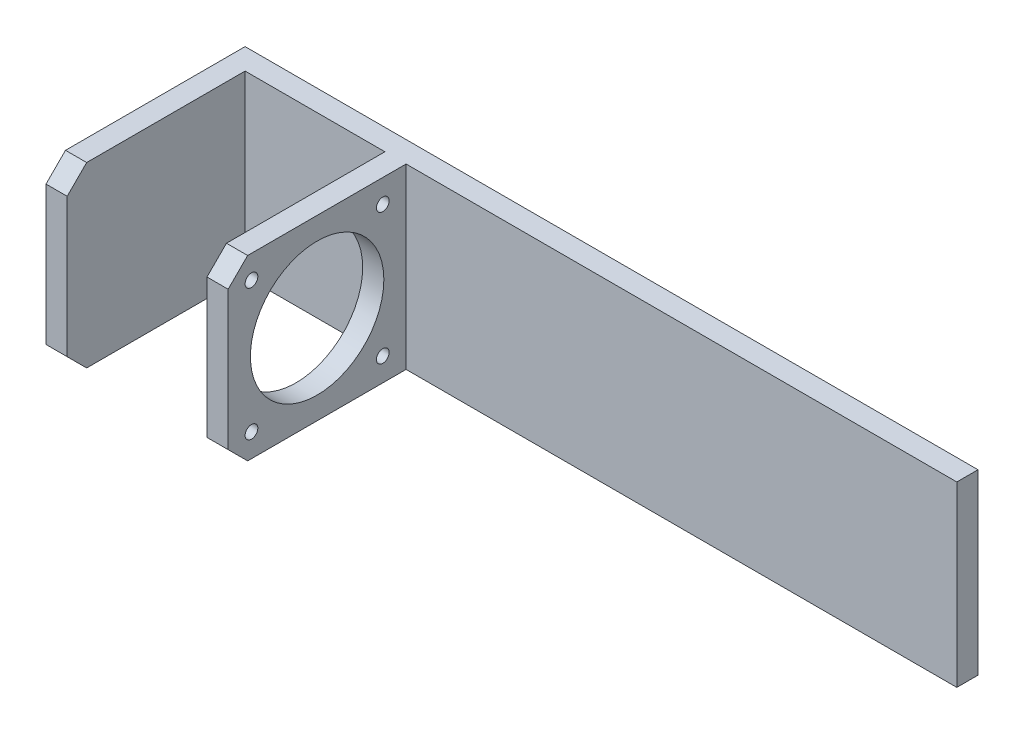
ISO-10303-21;
HEADER;
FILE_DESCRIPTION(('STEP AP214'),'2;1');
FILE_NAME('part.step','',(''),(''),'','','');
FILE_SCHEMA(('AUTOMOTIVE_DESIGN { 1 0 10303 214 1 1 1 1 }'));
ENDSEC;
DATA;
#1=APPLICATION_CONTEXT('core data for automotive mechanical design processes');
#2=APPLICATION_PROTOCOL_DEFINITION('international standard','automotive_design',2000,#1);
#3=PRODUCT_CONTEXT('',#1,'mechanical');
#4=PRODUCT('Part','Part','',(#3));
#5=PRODUCT_RELATED_PRODUCT_CATEGORY('part','',(#4));
#6=PRODUCT_DEFINITION_FORMATION('','',#4);
#7=PRODUCT_DEFINITION_CONTEXT('part definition',#1,'design');
#8=PRODUCT_DEFINITION('design','',#6,#7);
#9=PRODUCT_DEFINITION_SHAPE('','',#8);
#10=(LENGTH_UNIT() NAMED_UNIT(*) SI_UNIT(.MILLI.,.METRE.));
#11=(NAMED_UNIT(*) PLANE_ANGLE_UNIT() SI_UNIT($,.RADIAN.));
#12=(NAMED_UNIT(*) SI_UNIT($,.STERADIAN.) SOLID_ANGLE_UNIT());
#13=UNCERTAINTY_MEASURE_WITH_UNIT(LENGTH_MEASURE(1.E-05),#10,'distance_accuracy_value','');
#14=(GEOMETRIC_REPRESENTATION_CONTEXT(3) GLOBAL_UNCERTAINTY_ASSIGNED_CONTEXT((#13)) GLOBAL_UNIT_ASSIGNED_CONTEXT((#10,
#11,#12)) REPRESENTATION_CONTEXT('',''));
#15=CARTESIAN_POINT('',(0.,0.,0.));
#16=DIRECTION('',(0.,0.,1.));
#17=DIRECTION('',(1.,0.,0.));
#18=AXIS2_PLACEMENT_3D('',#15,#16,#17);
#19=CARTESIAN_POINT('',(0.,0.,0.));
#20=DIRECTION('',(1.,0.,0.));
#21=DIRECTION('',(0.,0.,-1.));
#22=AXIS2_PLACEMENT_3D('',#19,#20,#21);
#23=PLANE('',#22);
#24=CARTESIAN_POINT('',(0.,-15.5,15.5));
#25=DIRECTION('',(1.,0.,0.));
#26=DIRECTION('',(0.,0.,-1.));
#27=AXIS2_PLACEMENT_3D('',#24,#25,#26);
#28=CIRCLE('',#27,1.5);
#29=CARTESIAN_POINT('',(0.,-15.5,14.));
#30=VERTEX_POINT('',#29);
#31=EDGE_CURVE('E256',#30,#30,#28,.T.);
#32=ORIENTED_EDGE('',*,*,#31,.T.);
#33=EDGE_LOOP('',(#32));
#34=FACE_BOUND('',#33,.T.);
#35=CARTESIAN_POINT('',(0.,15.5,-15.5));
#36=DIRECTION('',(1.,0.,0.));
#37=DIRECTION('',(0.,0.,-1.));
#38=AXIS2_PLACEMENT_3D('',#35,#36,#37);
#39=CIRCLE('',#38,1.5);
#40=CARTESIAN_POINT('',(0.,15.5,-17.));
#41=VERTEX_POINT('',#40);
#42=EDGE_CURVE('E262',#41,#41,#39,.T.);
#43=ORIENTED_EDGE('',*,*,#42,.T.);
#44=EDGE_LOOP('',(#43));
#45=FACE_BOUND('',#44,.T.);
#46=CARTESIAN_POINT('',(0.,-15.5,-15.5));
#47=DIRECTION('',(1.,0.,0.));
#48=DIRECTION('',(0.,0.,-1.));
#49=AXIS2_PLACEMENT_3D('',#46,#47,#48);
#50=CIRCLE('',#49,1.5);
#51=CARTESIAN_POINT('',(0.,-15.5,-17.));
#52=VERTEX_POINT('',#51);
#53=EDGE_CURVE('E270',#52,#52,#50,.T.);
#54=ORIENTED_EDGE('',*,*,#53,.T.);
#55=EDGE_LOOP('',(#54));
#56=FACE_BOUND('',#55,.T.);
#57=CARTESIAN_POINT('',(0.,0.,0.));
#58=DIRECTION('',(1.,0.,0.));
#59=DIRECTION('',(0.,0.,-1.));
#60=AXIS2_PLACEMENT_3D('',#57,#58,#59);
#61=CIRCLE('',#60,15.75);
#62=CARTESIAN_POINT('',(0.,0.,-15.75));
#63=VERTEX_POINT('',#62);
#64=EDGE_CURVE('E278',#63,#63,#61,.T.);
#65=ORIENTED_EDGE('',*,*,#64,.T.);
#66=EDGE_LOOP('',(#65));
#67=FACE_BOUND('',#66,.T.);
#68=CARTESIAN_POINT('',(0.,15.5,15.5));
#69=DIRECTION('',(1.,0.,0.));
#70=DIRECTION('',(0.,0.,-1.));
#71=AXIS2_PLACEMENT_3D('',#68,#69,#70);
#72=CIRCLE('',#71,1.5);
#73=CARTESIAN_POINT('',(0.,15.5,14.));
#74=VERTEX_POINT('',#73);
#75=EDGE_CURVE('E286',#74,#74,#72,.T.);
#76=ORIENTED_EDGE('',*,*,#75,.T.);
#77=EDGE_LOOP('',(#76));
#78=FACE_BOUND('',#77,.T.);
#79=DIRECTION('',(0.,1.,0.));
#80=VECTOR('',#79,1.);
#81=CARTESIAN_POINT('',(0.,21.,-21.0000000004));
#82=LINE('',#81,#80);
#83=CARTESIAN_POINT('',(0.,-21.,-21.0000000004));
#84=VERTEX_POINT('',#83);
#85=CARTESIAN_POINT('',(0.,21.,-21.0000000004));
#86=VERTEX_POINT('',#85);
#87=EDGE_CURVE('E71',#84,#86,#82,.T.);
#88=ORIENTED_EDGE('',*,*,#87,.F.);
#89=DIRECTION('',(0.,0.,-1.));
#90=VECTOR('',#89,1.);
#91=CARTESIAN_POINT('',(0.,-21.,16.4000000004));
#92=LINE('',#91,#90);
#93=CARTESIAN_POINT('',(0.,-21.,16.4000000004));
#94=VERTEX_POINT('',#93);
#95=EDGE_CURVE('E325',#94,#84,#92,.T.);
#96=ORIENTED_EDGE('',*,*,#95,.F.);
#97=DIRECTION('',(0.,-0.707106781186547,-0.707106781186547));
#98=VECTOR('',#97,1.);
#99=CARTESIAN_POINT('',(0.,-16.4000000004,21.));
#100=LINE('',#99,#98);
#101=CARTESIAN_POINT('',(0.,-16.4000000004,21.));
#102=VERTEX_POINT('',#101);
#103=EDGE_CURVE('E322',#102,#94,#100,.T.);
#104=ORIENTED_EDGE('',*,*,#103,.F.);
#105=DIRECTION('',(0.,-1.,0.));
#106=VECTOR('',#105,1.);
#107=CARTESIAN_POINT('',(0.,16.4000000004,21.));
#108=LINE('',#107,#106);
#109=CARTESIAN_POINT('',(0.,16.4000000004,21.));
#110=VERTEX_POINT('',#109);
#111=EDGE_CURVE('E319',#110,#102,#108,.T.);
#112=ORIENTED_EDGE('',*,*,#111,.F.);
#113=DIRECTION('',(0.,-0.707106781186547,0.707106781186547));
#114=VECTOR('',#113,1.);
#115=CARTESIAN_POINT('',(0.,21.,16.4000000004));
#116=LINE('',#115,#114);
#117=CARTESIAN_POINT('',(0.,21.,16.4000000004));
#118=VERTEX_POINT('',#117);
#119=EDGE_CURVE('E294',#118,#110,#116,.T.);
#120=ORIENTED_EDGE('',*,*,#119,.F.);
#121=DIRECTION('',(0.,0.,1.));
#122=VECTOR('',#121,1.);
#123=CARTESIAN_POINT('',(0.,21.,-16.4000000004));
#124=LINE('',#123,#122);
#125=EDGE_CURVE('E303',#86,#118,#124,.T.);
#126=ORIENTED_EDGE('',*,*,#125,.F.);
#127=EDGE_LOOP('',(#88,#96,#104,#112,#120,#126));
#128=FACE_BOUND('',#127,.T.);
#129=ADVANCED_FACE('F47',(#34,#45,#56,#67,#78,#128),#23,.F.);
#130=CARTESIAN_POINT('',(5.,0.,0.));
#131=DIRECTION('',(1.,0.,0.));
#132=DIRECTION('',(0.,0.,-1.));
#133=AXIS2_PLACEMENT_3D('',#130,#131,#132);
#134=PLANE('',#133);
#135=DIRECTION('',(0.,-1.,0.));
#136=VECTOR('',#135,1.);
#137=CARTESIAN_POINT('',(5.,21.,-21.0000000004));
#138=LINE('',#137,#136);
#139=CARTESIAN_POINT('',(5.,21.,-21.0000000004));
#140=VERTEX_POINT('',#139);
#141=CARTESIAN_POINT('',(5.,-21.,-21.0000000004));
#142=VERTEX_POINT('',#141);
#143=EDGE_CURVE('E63',#140,#142,#138,.T.);
#144=ORIENTED_EDGE('',*,*,#143,.F.);
#145=DIRECTION('',(0.,0.,1.));
#146=VECTOR('',#145,1.);
#147=CARTESIAN_POINT('',(5.,21.,-16.4000000004));
#148=LINE('',#147,#146);
#149=CARTESIAN_POINT('',(5.,21.,16.4000000004));
#150=VERTEX_POINT('',#149);
#151=EDGE_CURVE('E312',#140,#150,#148,.T.);
#152=ORIENTED_EDGE('',*,*,#151,.T.);
#153=DIRECTION('',(0.,-0.707106781186547,0.707106781186547));
#154=VECTOR('',#153,1.);
#155=CARTESIAN_POINT('',(5.,21.,16.4000000004));
#156=LINE('',#155,#154);
#157=CARTESIAN_POINT('',(5.,16.4000000004,21.));
#158=VERTEX_POINT('',#157);
#159=EDGE_CURVE('E298',#150,#158,#156,.T.);
#160=ORIENTED_EDGE('',*,*,#159,.T.);
#161=DIRECTION('',(0.,-1.,0.));
#162=VECTOR('',#161,1.);
#163=CARTESIAN_POINT('',(5.,16.4000000004,21.));
#164=LINE('',#163,#162);
#165=CARTESIAN_POINT('',(5.,-16.4000000004,21.));
#166=VERTEX_POINT('',#165);
#167=EDGE_CURVE('E302',#158,#166,#164,.T.);
#168=ORIENTED_EDGE('',*,*,#167,.T.);
#169=DIRECTION('',(0.,-0.707106781186547,-0.707106781186547));
#170=VECTOR('',#169,1.);
#171=CARTESIAN_POINT('',(5.,-16.4000000004,21.));
#172=LINE('',#171,#170);
#173=CARTESIAN_POINT('',(5.,-21.,16.4000000004));
#174=VERTEX_POINT('',#173);
#175=EDGE_CURVE('E306',#166,#174,#172,.T.);
#176=ORIENTED_EDGE('',*,*,#175,.T.);
#177=DIRECTION('',(0.,0.,-1.));
#178=VECTOR('',#177,1.);
#179=CARTESIAN_POINT('',(5.,-21.,16.4000000004));
#180=LINE('',#179,#178);
#181=EDGE_CURVE('E309',#174,#142,#180,.T.);
#182=ORIENTED_EDGE('',*,*,#181,.T.);
#183=EDGE_LOOP('',(#144,#152,#160,#168,#176,#182));
#184=FACE_BOUND('',#183,.T.);
#185=CARTESIAN_POINT('',(5.,15.5,-15.5));
#186=DIRECTION('',(1.,0.,0.));
#187=DIRECTION('',(0.,0.,-1.));
#188=AXIS2_PLACEMENT_3D('',#185,#186,#187);
#189=CIRCLE('',#188,1.5);
#190=CARTESIAN_POINT('',(5.,15.5,-17.));
#191=VERTEX_POINT('',#190);
#192=EDGE_CURVE('E266',#191,#191,#189,.T.);
#193=ORIENTED_EDGE('',*,*,#192,.F.);
#194=EDGE_LOOP('',(#193));
#195=FACE_BOUND('',#194,.T.);
#196=CARTESIAN_POINT('',(5.,0.,0.));
#197=DIRECTION('',(1.,0.,0.));
#198=DIRECTION('',(0.,0.,-1.));
#199=AXIS2_PLACEMENT_3D('',#196,#197,#198);
#200=CIRCLE('',#199,15.75);
#201=CARTESIAN_POINT('',(5.,0.,-15.75));
#202=VERTEX_POINT('',#201);
#203=EDGE_CURVE('E282',#202,#202,#200,.T.);
#204=ORIENTED_EDGE('',*,*,#203,.F.);
#205=EDGE_LOOP('',(#204));
#206=FACE_BOUND('',#205,.T.);
#207=CARTESIAN_POINT('',(5.,15.5,15.5));
#208=DIRECTION('',(1.,0.,0.));
#209=DIRECTION('',(0.,0.,-1.));
#210=AXIS2_PLACEMENT_3D('',#207,#208,#209);
#211=CIRCLE('',#210,1.5);
#212=CARTESIAN_POINT('',(5.,15.5,14.));
#213=VERTEX_POINT('',#212);
#214=EDGE_CURVE('E290',#213,#213,#211,.T.);
#215=ORIENTED_EDGE('',*,*,#214,.F.);
#216=EDGE_LOOP('',(#215));
#217=FACE_BOUND('',#216,.T.);
#218=CARTESIAN_POINT('',(5.,-15.5,-15.5));
#219=DIRECTION('',(1.,0.,0.));
#220=DIRECTION('',(0.,0.,-1.));
#221=AXIS2_PLACEMENT_3D('',#218,#219,#220);
#222=CIRCLE('',#221,1.5);
#223=CARTESIAN_POINT('',(5.,-15.5,-17.));
#224=VERTEX_POINT('',#223);
#225=EDGE_CURVE('E274',#224,#224,#222,.T.);
#226=ORIENTED_EDGE('',*,*,#225,.F.);
#227=EDGE_LOOP('',(#226));
#228=FACE_BOUND('',#227,.T.);
#229=CARTESIAN_POINT('',(5.,-15.5,15.5));
#230=DIRECTION('',(1.,0.,0.));
#231=DIRECTION('',(0.,0.,-1.));
#232=AXIS2_PLACEMENT_3D('',#229,#230,#231);
#233=CIRCLE('',#232,1.5);
#234=CARTESIAN_POINT('',(5.,-15.5,14.));
#235=VERTEX_POINT('',#234);
#236=EDGE_CURVE('E258',#235,#235,#233,.T.);
#237=ORIENTED_EDGE('',*,*,#236,.F.);
#238=EDGE_LOOP('',(#237));
#239=FACE_BOUND('',#238,.T.);
#240=ADVANCED_FACE('F381',(#184,#195,#206,#217,#228,#239),#134,.T.);
#241=CARTESIAN_POINT('',(5.,21.,16.4000000004));
#242=DIRECTION('',(0.,-0.707106781186548,-0.707106781186548));
#243=DIRECTION('',(0.,0.707106781186548,-0.707106781186548));
#244=AXIS2_PLACEMENT_3D('',#241,#242,#243);
#245=PLANE('',#244);
#246=ORIENTED_EDGE('',*,*,#119,.T.);
#247=DIRECTION('',(-1.,0.,0.));
#248=VECTOR('',#247,1.);
#249=CARTESIAN_POINT('',(5.,16.4000000004,21.));
#250=LINE('',#249,#248);
#251=EDGE_CURVE('E11',#158,#110,#250,.T.);
#252=ORIENTED_EDGE('',*,*,#251,.F.);
#253=ORIENTED_EDGE('',*,*,#159,.F.);
#254=DIRECTION('',(-1.,0.,0.));
#255=VECTOR('',#254,1.);
#256=CARTESIAN_POINT('',(5.,21.,16.4000000004));
#257=LINE('',#256,#255);
#258=EDGE_CURVE('E315',#150,#118,#257,.T.);
#259=ORIENTED_EDGE('',*,*,#258,.T.);
#260=EDGE_LOOP('',(#246,#252,#253,#259));
#261=FACE_BOUND('',#260,.T.);
#262=ADVANCED_FACE('F49',(#261),#245,.F.);
#263=CARTESIAN_POINT('',(5.,16.4000000004,21.));
#264=DIRECTION('',(0.,0.,-1.));
#265=DIRECTION('',(-1.,0.,0.));
#266=AXIS2_PLACEMENT_3D('',#263,#264,#265);
#267=PLANE('',#266);
#268=ORIENTED_EDGE('',*,*,#111,.T.);
#269=DIRECTION('',(-1.,0.,0.));
#270=VECTOR('',#269,1.);
#271=CARTESIAN_POINT('',(5.,-16.4000000004,21.));
#272=LINE('',#271,#270);
#273=EDGE_CURVE('E56',#166,#102,#272,.T.);
#274=ORIENTED_EDGE('',*,*,#273,.F.);
#275=ORIENTED_EDGE('',*,*,#167,.F.);
#276=ORIENTED_EDGE('',*,*,#251,.T.);
#277=EDGE_LOOP('',(#268,#274,#275,#276));
#278=FACE_BOUND('',#277,.T.);
#279=ADVANCED_FACE('F397',(#278),#267,.F.);
#280=CARTESIAN_POINT('',(5.,-16.4000000004,21.));
#281=DIRECTION('',(0.,0.707106781186548,-0.707106781186548));
#282=DIRECTION('',(0.,0.707106781186548,0.707106781186548));
#283=AXIS2_PLACEMENT_3D('',#280,#281,#282);
#284=PLANE('',#283);
#285=ORIENTED_EDGE('',*,*,#103,.T.);
#286=DIRECTION('',(-1.,0.,0.));
#287=VECTOR('',#286,1.);
#288=CARTESIAN_POINT('',(5.,-21.,16.4000000004));
#289=LINE('',#288,#287);
#290=EDGE_CURVE('E333',#174,#94,#289,.T.);
#291=ORIENTED_EDGE('',*,*,#290,.F.);
#292=ORIENTED_EDGE('',*,*,#175,.F.);
#293=ORIENTED_EDGE('',*,*,#273,.T.);
#294=EDGE_LOOP('',(#285,#291,#292,#293));
#295=FACE_BOUND('',#294,.T.);
#296=ADVANCED_FACE('F342',(#295),#284,.F.);
#297=CARTESIAN_POINT('',(5.,-21.,16.4000000004));
#298=DIRECTION('',(0.,1.,0.));
#299=DIRECTION('',(0.,0.,1.));
#300=AXIS2_PLACEMENT_3D('',#297,#298,#299);
#301=PLANE('',#300);
#302=ORIENTED_EDGE('',*,*,#95,.T.);
#303=DIRECTION('',(1.,0.,0.));
#304=VECTOR('',#303,1.);
#305=CARTESIAN_POINT('',(-33.,-21.,-21.0000000004));
#306=LINE('',#305,#304);
#307=CARTESIAN_POINT('',(-33.,-21.,-21.0000000004));
#308=VERTEX_POINT('',#307);
#309=EDGE_CURVE('E162',#308,#84,#306,.T.);
#310=ORIENTED_EDGE('',*,*,#309,.F.);
#311=DIRECTION('',(0.,0.,1.));
#312=VECTOR('',#311,1.);
#313=CARTESIAN_POINT('',(-33.,-21.,0.));
#314=LINE('',#313,#312);
#315=CARTESIAN_POINT('',(-33.,-21.,16.4000000004));
#316=VERTEX_POINT('',#315);
#317=EDGE_CURVE('E216',#308,#316,#314,.T.);
#318=ORIENTED_EDGE('',*,*,#317,.T.);
#319=DIRECTION('',(1.,0.,0.));
#320=VECTOR('',#319,1.);
#321=CARTESIAN_POINT('',(-38.,-21.,16.4000000004));
#322=LINE('',#321,#320);
#323=CARTESIAN_POINT('',(-38.,-21.,16.4000000004));
#324=VERTEX_POINT('',#323);
#325=EDGE_CURVE('E238',#324,#316,#322,.T.);
#326=ORIENTED_EDGE('',*,*,#325,.F.);
#327=DIRECTION('',(0.,0.,1.));
#328=VECTOR('',#327,1.);
#329=CARTESIAN_POINT('',(-38.,-21.,0.));
#330=LINE('',#329,#328);
#331=CARTESIAN_POINT('',(-38.,-21.,-26.0000000004));
#332=VERTEX_POINT('',#331);
#333=EDGE_CURVE('E200',#332,#324,#330,.T.);
#334=ORIENTED_EDGE('',*,*,#333,.F.);
#335=DIRECTION('',(1.,0.,0.));
#336=VECTOR('',#335,1.);
#337=CARTESIAN_POINT('',(0.,-21.,-26.0000000004));
#338=LINE('',#337,#336);
#339=CARTESIAN_POINT('',(135.,-21.,-26.0000000004));
#340=VERTEX_POINT('',#339);
#341=EDGE_CURVE('E161',#332,#340,#338,.T.);
#342=ORIENTED_EDGE('',*,*,#341,.T.);
#343=DIRECTION('',(0.,0.,-1.));
#344=VECTOR('',#343,1.);
#345=CARTESIAN_POINT('',(135.,-21.,-26.0000000004));
#346=LINE('',#345,#344);
#347=CARTESIAN_POINT('',(135.,-21.,-21.0000000004));
#348=VERTEX_POINT('',#347);
#349=EDGE_CURVE('E177',#348,#340,#346,.T.);
#350=ORIENTED_EDGE('',*,*,#349,.F.);
#351=DIRECTION('',(-1.,0.,0.));
#352=VECTOR('',#351,1.);
#353=CARTESIAN_POINT('',(135.,-21.,-21.0000000004));
#354=LINE('',#353,#352);
#355=EDGE_CURVE('E186',#348,#142,#354,.T.);
#356=ORIENTED_EDGE('',*,*,#355,.T.);
#357=ORIENTED_EDGE('',*,*,#181,.F.);
#358=ORIENTED_EDGE('',*,*,#290,.T.);
#359=EDGE_LOOP('',(#302,#310,#318,#326,#334,#342,#350,#356,#357,#358));
#360=FACE_BOUND('',#359,.T.);
#361=ADVANCED_FACE('F347',(#360),#301,.F.);
#362=CARTESIAN_POINT('',(5.,21.,-16.4000000004));
#363=DIRECTION('',(0.,-1.,0.));
#364=DIRECTION('',(0.,0.,-1.));
#365=AXIS2_PLACEMENT_3D('',#362,#363,#364);
#366=PLANE('',#365);
#367=DIRECTION('',(1.,0.,0.));
#368=VECTOR('',#367,1.);
#369=CARTESIAN_POINT('',(0.,21.,-26.0000000004));
#370=LINE('',#369,#368);
#371=CARTESIAN_POINT('',(-38.,21.,-26.0000000004));
#372=VERTEX_POINT('',#371);
#373=CARTESIAN_POINT('',(135.,21.,-26.0000000004));
#374=VERTEX_POINT('',#373);
#375=EDGE_CURVE('E150',#372,#374,#370,.T.);
#376=ORIENTED_EDGE('',*,*,#375,.F.);
#377=DIRECTION('',(0.,0.,-1.));
#378=VECTOR('',#377,1.);
#379=CARTESIAN_POINT('',(-38.,21.,0.));
#380=LINE('',#379,#378);
#381=CARTESIAN_POINT('',(-38.,21.,16.4000000004));
#382=VERTEX_POINT('',#381);
#383=EDGE_CURVE('E194',#382,#372,#380,.T.);
#384=ORIENTED_EDGE('',*,*,#383,.F.);
#385=DIRECTION('',(1.,0.,0.));
#386=VECTOR('',#385,1.);
#387=CARTESIAN_POINT('',(-38.,21.,16.4000000004));
#388=LINE('',#387,#386);
#389=CARTESIAN_POINT('',(-33.,21.,16.4000000004));
#390=VERTEX_POINT('',#389);
#391=EDGE_CURVE('E212',#382,#390,#388,.T.);
#392=ORIENTED_EDGE('',*,*,#391,.T.);
#393=DIRECTION('',(0.,0.,-1.));
#394=VECTOR('',#393,1.);
#395=CARTESIAN_POINT('',(-33.,21.,0.));
#396=LINE('',#395,#394);
#397=CARTESIAN_POINT('',(-33.,21.,-21.0000000004));
#398=VERTEX_POINT('',#397);
#399=EDGE_CURVE('E193',#390,#398,#396,.T.);
#400=ORIENTED_EDGE('',*,*,#399,.T.);
#401=DIRECTION('',(1.,0.,0.));
#402=VECTOR('',#401,1.);
#403=CARTESIAN_POINT('',(-33.,21.,-21.0000000004));
#404=LINE('',#403,#402);
#405=EDGE_CURVE('E246',#398,#86,#404,.T.);
#406=ORIENTED_EDGE('',*,*,#405,.T.);
#407=ORIENTED_EDGE('',*,*,#125,.T.);
#408=ORIENTED_EDGE('',*,*,#258,.F.);
#409=ORIENTED_EDGE('',*,*,#151,.F.);
#410=DIRECTION('',(-1.,0.,0.));
#411=VECTOR('',#410,1.);
#412=CARTESIAN_POINT('',(135.,21.,-21.0000000004));
#413=LINE('',#412,#411);
#414=CARTESIAN_POINT('',(135.,21.,-21.0000000004));
#415=VERTEX_POINT('',#414);
#416=EDGE_CURVE('E168',#415,#140,#413,.T.);
#417=ORIENTED_EDGE('',*,*,#416,.F.);
#418=DIRECTION('',(0.,0.,1.));
#419=VECTOR('',#418,1.);
#420=CARTESIAN_POINT('',(135.,21.,-26.0000000004));
#421=LINE('',#420,#419);
#422=EDGE_CURVE('E165',#374,#415,#421,.T.);
#423=ORIENTED_EDGE('',*,*,#422,.F.);
#424=EDGE_LOOP('',(#376,#384,#392,#400,#406,#407,#408,#409,#417,#423));
#425=FACE_BOUND('',#424,.T.);
#426=ADVANCED_FACE('F166',(#425),#366,.F.);
#427=CARTESIAN_POINT('',(5.,15.5,15.5));
#428=DIRECTION('',(-1.,0.,0.));
#429=DIRECTION('',(0.,0.,1.));
#430=AXIS2_PLACEMENT_3D('',#427,#428,#429);
#431=CYLINDRICAL_SURFACE('',#430,1.5);
#432=ORIENTED_EDGE('',*,*,#75,.F.);
#433=EDGE_LOOP('',(#432));
#434=FACE_BOUND('',#433,.T.);
#435=ORIENTED_EDGE('',*,*,#214,.T.);
#436=EDGE_LOOP('',(#435));
#437=FACE_BOUND('',#436,.T.);
#438=ADVANCED_FACE('F393',(#434,#437),#431,.F.);
#439=CARTESIAN_POINT('',(5.,0.,0.));
#440=DIRECTION('',(-1.,0.,0.));
#441=DIRECTION('',(0.,0.,1.));
#442=AXIS2_PLACEMENT_3D('',#439,#440,#441);
#443=CYLINDRICAL_SURFACE('',#442,15.75);
#444=ORIENTED_EDGE('',*,*,#64,.F.);
#445=EDGE_LOOP('',(#444));
#446=FACE_BOUND('',#445,.T.);
#447=ORIENTED_EDGE('',*,*,#203,.T.);
#448=EDGE_LOOP('',(#447));
#449=FACE_BOUND('',#448,.T.);
#450=ADVANCED_FACE('F437',(#446,#449),#443,.F.);
#451=CARTESIAN_POINT('',(5.,-15.5,-15.5));
#452=DIRECTION('',(-1.,0.,0.));
#453=DIRECTION('',(0.,0.,1.));
#454=AXIS2_PLACEMENT_3D('',#451,#452,#453);
#455=CYLINDRICAL_SURFACE('',#454,1.5);
#456=ORIENTED_EDGE('',*,*,#53,.F.);
#457=EDGE_LOOP('',(#456));
#458=FACE_BOUND('',#457,.T.);
#459=ORIENTED_EDGE('',*,*,#225,.T.);
#460=EDGE_LOOP('',(#459));
#461=FACE_BOUND('',#460,.T.);
#462=ADVANCED_FACE('F433',(#458,#461),#455,.F.);
#463=CARTESIAN_POINT('',(5.,15.5,-15.5));
#464=DIRECTION('',(-1.,0.,0.));
#465=DIRECTION('',(0.,0.,1.));
#466=AXIS2_PLACEMENT_3D('',#463,#464,#465);
#467=CYLINDRICAL_SURFACE('',#466,1.5);
#468=ORIENTED_EDGE('',*,*,#42,.F.);
#469=EDGE_LOOP('',(#468));
#470=FACE_BOUND('',#469,.T.);
#471=ORIENTED_EDGE('',*,*,#192,.T.);
#472=EDGE_LOOP('',(#471));
#473=FACE_BOUND('',#472,.T.);
#474=ADVANCED_FACE('F429',(#470,#473),#467,.F.);
#475=CARTESIAN_POINT('',(5.,-15.5,15.5));
#476=DIRECTION('',(-1.,0.,0.));
#477=DIRECTION('',(0.,0.,1.));
#478=AXIS2_PLACEMENT_3D('',#475,#476,#477);
#479=CYLINDRICAL_SURFACE('',#478,1.5);
#480=ORIENTED_EDGE('',*,*,#31,.F.);
#481=EDGE_LOOP('',(#480));
#482=FACE_BOUND('',#481,.T.);
#483=ORIENTED_EDGE('',*,*,#236,.T.);
#484=EDGE_LOOP('',(#483));
#485=FACE_BOUND('',#484,.T.);
#486=ADVANCED_FACE('F426',(#482,#485),#479,.F.);
#487=CARTESIAN_POINT('',(0.,0.,-26.0000000004));
#488=DIRECTION('',(0.,0.,1.));
#489=DIRECTION('',(0.,-1.,0.));
#490=AXIS2_PLACEMENT_3D('',#487,#488,#489);
#491=PLANE('',#490);
#492=ORIENTED_EDGE('',*,*,#375,.T.);
#493=DIRECTION('',(0.,1.,0.));
#494=VECTOR('',#493,1.);
#495=CARTESIAN_POINT('',(135.,21.,-26.0000000004));
#496=LINE('',#495,#494);
#497=EDGE_CURVE('E154',#340,#374,#496,.T.);
#498=ORIENTED_EDGE('',*,*,#497,.F.);
#499=ORIENTED_EDGE('',*,*,#341,.F.);
#500=DIRECTION('',(0.,-1.,0.));
#501=VECTOR('',#500,1.);
#502=CARTESIAN_POINT('',(-38.,0.,-26.0000000004));
#503=LINE('',#502,#501);
#504=EDGE_CURVE('E156',#372,#332,#503,.T.);
#505=ORIENTED_EDGE('',*,*,#504,.F.);
#506=EDGE_LOOP('',(#492,#498,#499,#505));
#507=FACE_BOUND('',#506,.T.);
#508=ADVANCED_FACE('F152',(#507),#491,.F.);
#509=CARTESIAN_POINT('',(-33.,21.,-21.0000000004));
#510=DIRECTION('',(0.,0.,-1.));
#511=DIRECTION('',(0.,1.,0.));
#512=AXIS2_PLACEMENT_3D('',#509,#510,#511);
#513=PLANE('',#512);
#514=ORIENTED_EDGE('',*,*,#87,.T.);
#515=ORIENTED_EDGE('',*,*,#405,.F.);
#516=DIRECTION('',(0.,1.,0.));
#517=VECTOR('',#516,1.);
#518=CARTESIAN_POINT('',(-33.,21.,-21.0000000004));
#519=LINE('',#518,#517);
#520=EDGE_CURVE('E242',#308,#398,#519,.T.);
#521=ORIENTED_EDGE('',*,*,#520,.F.);
#522=ORIENTED_EDGE('',*,*,#309,.T.);
#523=EDGE_LOOP('',(#514,#515,#521,#522));
#524=FACE_BOUND('',#523,.T.);
#525=ADVANCED_FACE('F351',(#524),#513,.F.);
#526=CARTESIAN_POINT('',(-33.,0.,0.));
#527=DIRECTION('',(-1.,0.,0.));
#528=DIRECTION('',(0.,0.,1.));
#529=AXIS2_PLACEMENT_3D('',#526,#527,#528);
#530=PLANE('',#529);
#531=ORIENTED_EDGE('',*,*,#317,.F.);
#532=ORIENTED_EDGE('',*,*,#520,.T.);
#533=ORIENTED_EDGE('',*,*,#399,.F.);
#534=DIRECTION('',(0.,0.707106781186548,-0.707106781186548));
#535=VECTOR('',#534,1.);
#536=CARTESIAN_POINT('',(-33.,18.7000000002,18.7000000002));
#537=LINE('',#536,#535);
#538=CARTESIAN_POINT('',(-33.,16.4000000004,21.));
#539=VERTEX_POINT('',#538);
#540=EDGE_CURVE('E197',#539,#390,#537,.T.);
#541=ORIENTED_EDGE('',*,*,#540,.F.);
#542=DIRECTION('',(0.,1.,0.));
#543=VECTOR('',#542,1.);
#544=CARTESIAN_POINT('',(-33.,0.,21.));
#545=LINE('',#544,#543);
#546=CARTESIAN_POINT('',(-33.,-16.4000000004,21.));
#547=VERTEX_POINT('',#546);
#548=EDGE_CURVE('E222',#547,#539,#545,.T.);
#549=ORIENTED_EDGE('',*,*,#548,.F.);
#550=DIRECTION('',(0.,0.707106781186548,0.707106781186548));
#551=VECTOR('',#550,1.);
#552=CARTESIAN_POINT('',(-33.,-18.7000000002,18.7000000002));
#553=LINE('',#552,#551);
#554=EDGE_CURVE('E219',#316,#547,#553,.T.);
#555=ORIENTED_EDGE('',*,*,#554,.F.);
#556=EDGE_LOOP('',(#531,#532,#533,#541,#549,#555));
#557=FACE_BOUND('',#556,.T.);
#558=ADVANCED_FACE('F356',(#557),#530,.F.);
#559=CARTESIAN_POINT('',(-38.,-18.7000000002,18.7000000002));
#560=DIRECTION('',(0.,0.707106781186548,-0.707106781186548));
#561=DIRECTION('',(0.,0.707106781186548,0.707106781186548));
#562=AXIS2_PLACEMENT_3D('',#559,#560,#561);
#563=PLANE('',#562);
#564=ORIENTED_EDGE('',*,*,#554,.T.);
#565=DIRECTION('',(1.,0.,0.));
#566=VECTOR('',#565,1.);
#567=CARTESIAN_POINT('',(-38.,-16.4000000004,21.));
#568=LINE('',#567,#566);
#569=CARTESIAN_POINT('',(-38.,-16.4000000004,21.));
#570=VERTEX_POINT('',#569);
#571=EDGE_CURVE('E234',#570,#547,#568,.T.);
#572=ORIENTED_EDGE('',*,*,#571,.F.);
#573=DIRECTION('',(0.,0.707106781186548,0.707106781186548));
#574=VECTOR('',#573,1.);
#575=CARTESIAN_POINT('',(-38.,-18.7000000002,18.7000000002));
#576=LINE('',#575,#574);
#577=EDGE_CURVE('E203',#324,#570,#576,.T.);
#578=ORIENTED_EDGE('',*,*,#577,.F.);
#579=ORIENTED_EDGE('',*,*,#325,.T.);
#580=EDGE_LOOP('',(#564,#572,#578,#579));
#581=FACE_BOUND('',#580,.T.);
#582=ADVANCED_FACE('F362',(#581),#563,.F.);
#583=CARTESIAN_POINT('',(-38.,0.,21.));
#584=DIRECTION('',(0.,0.,-1.));
#585=DIRECTION('',(-1.,0.,0.));
#586=AXIS2_PLACEMENT_3D('',#583,#584,#585);
#587=PLANE('',#586);
#588=ORIENTED_EDGE('',*,*,#548,.T.);
#589=DIRECTION('',(1.,0.,0.));
#590=VECTOR('',#589,1.);
#591=CARTESIAN_POINT('',(-38.,16.4000000004,21.));
#592=LINE('',#591,#590);
#593=CARTESIAN_POINT('',(-38.,16.4000000004,21.));
#594=VERTEX_POINT('',#593);
#595=EDGE_CURVE('E230',#594,#539,#592,.T.);
#596=ORIENTED_EDGE('',*,*,#595,.F.);
#597=DIRECTION('',(0.,1.,0.));
#598=VECTOR('',#597,1.);
#599=CARTESIAN_POINT('',(-38.,0.,21.));
#600=LINE('',#599,#598);
#601=EDGE_CURVE('E206',#570,#594,#600,.T.);
#602=ORIENTED_EDGE('',*,*,#601,.F.);
#603=ORIENTED_EDGE('',*,*,#571,.T.);
#604=EDGE_LOOP('',(#588,#596,#602,#603));
#605=FACE_BOUND('',#604,.T.);
#606=ADVANCED_FACE('F411',(#605),#587,.F.);
#607=CARTESIAN_POINT('',(-38.,18.7000000002,18.7000000002));
#608=DIRECTION('',(0.,-0.707106781186548,-0.707106781186548));
#609=DIRECTION('',(0.,0.707106781186548,-0.707106781186548));
#610=AXIS2_PLACEMENT_3D('',#607,#608,#609);
#611=PLANE('',#610);
#612=ORIENTED_EDGE('',*,*,#540,.T.);
#613=ORIENTED_EDGE('',*,*,#391,.F.);
#614=DIRECTION('',(0.,0.707106781186548,-0.707106781186548));
#615=VECTOR('',#614,1.);
#616=CARTESIAN_POINT('',(-38.,18.7000000002,18.7000000002));
#617=LINE('',#616,#615);
#618=EDGE_CURVE('E209',#594,#382,#617,.T.);
#619=ORIENTED_EDGE('',*,*,#618,.F.);
#620=ORIENTED_EDGE('',*,*,#595,.T.);
#621=EDGE_LOOP('',(#612,#613,#619,#620));
#622=FACE_BOUND('',#621,.T.);
#623=ADVANCED_FACE('F378',(#622),#611,.F.);
#624=CARTESIAN_POINT('',(-38.,0.,0.));
#625=DIRECTION('',(-1.,0.,0.));
#626=DIRECTION('',(0.,0.,1.));
#627=AXIS2_PLACEMENT_3D('',#624,#625,#626);
#628=PLANE('',#627);
#629=ORIENTED_EDGE('',*,*,#383,.T.);
#630=ORIENTED_EDGE('',*,*,#504,.T.);
#631=ORIENTED_EDGE('',*,*,#333,.T.);
#632=ORIENTED_EDGE('',*,*,#577,.T.);
#633=ORIENTED_EDGE('',*,*,#601,.T.);
#634=ORIENTED_EDGE('',*,*,#618,.T.);
#635=EDGE_LOOP('',(#629,#630,#631,#632,#633,#634));
#636=FACE_BOUND('',#635,.T.);
#637=ADVANCED_FACE('F366',(#636),#628,.T.);
#638=CARTESIAN_POINT('',(135.,21.,-21.0000000004));
#639=DIRECTION('',(0.,0.,-1.));
#640=DIRECTION('',(0.,1.,0.));
#641=AXIS2_PLACEMENT_3D('',#638,#639,#640);
#642=PLANE('',#641);
#643=ORIENTED_EDGE('',*,*,#143,.T.);
#644=ORIENTED_EDGE('',*,*,#355,.F.);
#645=DIRECTION('',(0.,-1.,0.));
#646=VECTOR('',#645,1.);
#647=CARTESIAN_POINT('',(135.,21.,-21.0000000004));
#648=LINE('',#647,#646);
#649=EDGE_CURVE('E172',#415,#348,#648,.T.);
#650=ORIENTED_EDGE('',*,*,#649,.F.);
#651=ORIENTED_EDGE('',*,*,#416,.T.);
#652=EDGE_LOOP('',(#643,#644,#650,#651));
#653=FACE_BOUND('',#652,.T.);
#654=ADVANCED_FACE('F370',(#653),#642,.F.);
#655=CARTESIAN_POINT('',(135.,0.,0.));
#656=DIRECTION('',(-1.,0.,0.));
#657=DIRECTION('',(0.,0.,1.));
#658=AXIS2_PLACEMENT_3D('',#655,#656,#657);
#659=PLANE('',#658);
#660=ORIENTED_EDGE('',*,*,#497,.T.);
#661=ORIENTED_EDGE('',*,*,#422,.T.);
#662=ORIENTED_EDGE('',*,*,#649,.T.);
#663=ORIENTED_EDGE('',*,*,#349,.T.);
#664=EDGE_LOOP('',(#660,#661,#662,#663));
#665=FACE_BOUND('',#664,.T.);
#666=ADVANCED_FACE('F175',(#665),#659,.F.);
#667=CLOSED_SHELL('',(#129,#240,#262,#279,#296,#361,#426,#438,#450,#462,#474,#486,#508,#525,
#558,#582,#606,#623,#637,#654,#666));
#668=MANIFOLD_SOLID_BREP('B2',#667);
#669=ADVANCED_BREP_SHAPE_REPRESENTATION('',(#18,#668),#14);
#670=SHAPE_DEFINITION_REPRESENTATION(#9,#669);
ENDSEC;
END-ISO-10303-21;
